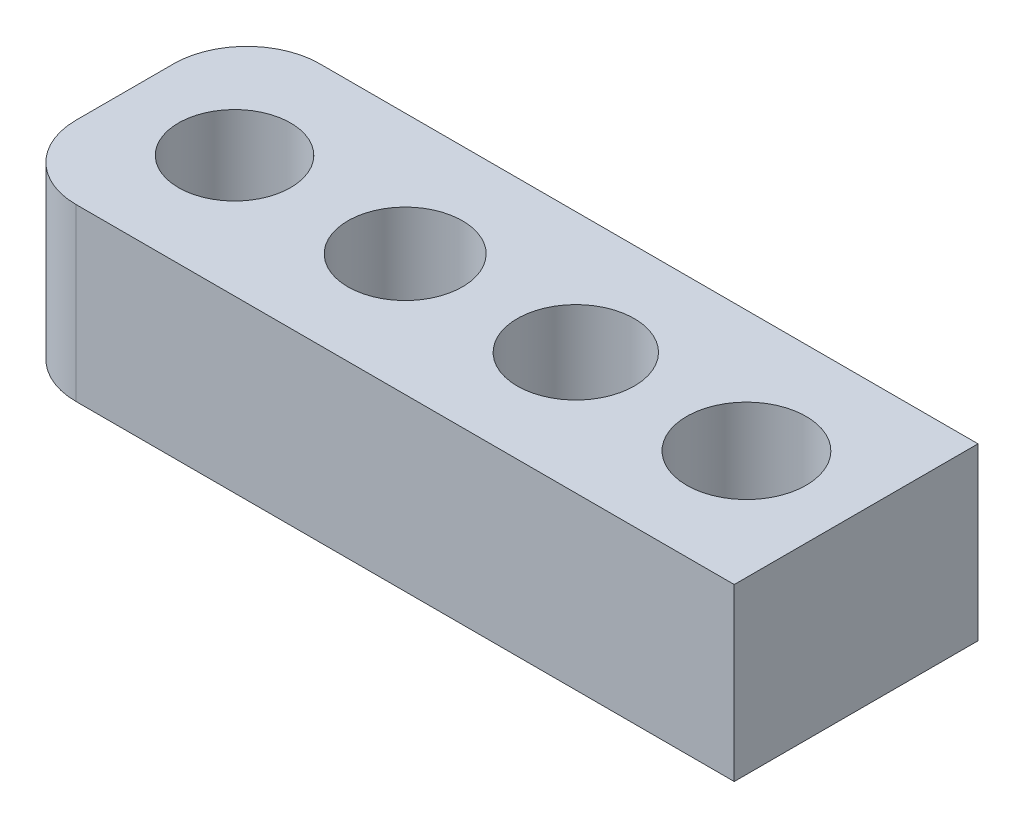
ISO-10303-21;
HEADER;
FILE_DESCRIPTION(('STEP AP214'),'2;1');
FILE_NAME('part.step','',(''),(''),'','','');
FILE_SCHEMA(('AUTOMOTIVE_DESIGN { 1 0 10303 214 1 1 1 1 }'));
ENDSEC;
DATA;
#1=APPLICATION_CONTEXT('core data for automotive mechanical design processes');
#2=APPLICATION_PROTOCOL_DEFINITION('international standard','automotive_design',2000,#1);
#3=PRODUCT_CONTEXT('',#1,'mechanical');
#4=PRODUCT('Part','Part','',(#3));
#5=PRODUCT_RELATED_PRODUCT_CATEGORY('part','',(#4));
#6=PRODUCT_DEFINITION_FORMATION('','',#4);
#7=PRODUCT_DEFINITION_CONTEXT('part definition',#1,'design');
#8=PRODUCT_DEFINITION('design','',#6,#7);
#9=PRODUCT_DEFINITION_SHAPE('','',#8);
#10=(LENGTH_UNIT() NAMED_UNIT(*) SI_UNIT(.MILLI.,.METRE.));
#11=(NAMED_UNIT(*) PLANE_ANGLE_UNIT() SI_UNIT($,.RADIAN.));
#12=(NAMED_UNIT(*) SI_UNIT($,.STERADIAN.) SOLID_ANGLE_UNIT());
#13=UNCERTAINTY_MEASURE_WITH_UNIT(LENGTH_MEASURE(1.E-05),#10,'distance_accuracy_value','');
#14=(GEOMETRIC_REPRESENTATION_CONTEXT(3) GLOBAL_UNCERTAINTY_ASSIGNED_CONTEXT((#13)) GLOBAL_UNIT_ASSIGNED_CONTEXT((#10,
#11,#12)) REPRESENTATION_CONTEXT('',''));
#15=CARTESIAN_POINT('',(0.,0.,0.));
#16=DIRECTION('',(0.,0.,1.));
#17=DIRECTION('',(1.,0.,0.));
#18=AXIS2_PLACEMENT_3D('',#15,#16,#17);
#19=CARTESIAN_POINT('',(0.,7.,0.));
#20=DIRECTION('',(0.,-1.,0.));
#21=DIRECTION('',(0.,0.,-1.));
#22=AXIS2_PLACEMENT_3D('',#19,#20,#21);
#23=PLANE('',#22);
#24=DIRECTION('',(0.,0.,1.));
#25=VECTOR('',#24,1.);
#26=CARTESIAN_POINT('',(0.,7.,0.));
#27=LINE('',#26,#25);
#28=CARTESIAN_POINT('',(0.,7.,-7.));
#29=VERTEX_POINT('',#28);
#30=CARTESIAN_POINT('',(0.,7.,-3.));
#31=VERTEX_POINT('',#30);
#32=EDGE_CURVE('E101',#29,#31,#27,.T.);
#33=ORIENTED_EDGE('',*,*,#32,.T.);
#34=CARTESIAN_POINT('',(3.,7.,-3.));
#35=DIRECTION('',(0.,-1.,0.));
#36=DIRECTION('',(0.,0.,-1.));
#37=AXIS2_PLACEMENT_3D('',#34,#35,#36);
#38=CIRCLE('',#37,3.);
#39=CARTESIAN_POINT('',(3.,7.,0.));
#40=VERTEX_POINT('',#39);
#41=EDGE_CURVE('E45',#31,#40,#38,.F.);
#42=ORIENTED_EDGE('',*,*,#41,.T.);
#43=DIRECTION('',(1.,0.,0.));
#44=VECTOR('',#43,1.);
#45=CARTESIAN_POINT('',(0.,7.,0.));
#46=LINE('',#45,#44);
#47=CARTESIAN_POINT('',(30.,7.,0.));
#48=VERTEX_POINT('',#47);
#49=EDGE_CURVE('E91',#40,#48,#46,.T.);
#50=ORIENTED_EDGE('',*,*,#49,.T.);
#51=DIRECTION('',(0.,0.,-1.));
#52=VECTOR('',#51,1.);
#53=CARTESIAN_POINT('',(30.,7.,0.));
#54=LINE('',#53,#52);
#55=CARTESIAN_POINT('',(30.,7.,-10.));
#56=VERTEX_POINT('',#55);
#57=EDGE_CURVE('E95',#48,#56,#54,.T.);
#58=ORIENTED_EDGE('',*,*,#57,.T.);
#59=DIRECTION('',(-1.,0.,0.));
#60=VECTOR('',#59,1.);
#61=CARTESIAN_POINT('',(0.,7.,-10.));
#62=LINE('',#61,#60);
#63=CARTESIAN_POINT('',(3.,7.,-10.));
#64=VERTEX_POINT('',#63);
#65=EDGE_CURVE('E115',#56,#64,#62,.T.);
#66=ORIENTED_EDGE('',*,*,#65,.T.);
#67=CARTESIAN_POINT('',(3.,7.,-7.));
#68=DIRECTION('',(0.,-1.,0.));
#69=DIRECTION('',(0.,0.,-1.));
#70=AXIS2_PLACEMENT_3D('',#67,#68,#69);
#71=CIRCLE('',#70,3.);
#72=EDGE_CURVE('E138',#64,#29,#71,.F.);
#73=ORIENTED_EDGE('',*,*,#72,.T.);
#74=EDGE_LOOP('',(#33,#42,#50,#58,#66,#73));
#75=FACE_BOUND('',#74,.T.);
#76=CARTESIAN_POINT('',(4.5,7.,-5.));
#77=DIRECTION('',(0.,1.,0.));
#78=DIRECTION('',(0.,0.,1.));
#79=AXIS2_PLACEMENT_3D('',#76,#77,#78);
#80=CIRCLE('',#79,2.3);
#81=CARTESIAN_POINT('',(4.5,7.,-2.7));
#82=VERTEX_POINT('',#81);
#83=EDGE_CURVE('E122',#82,#82,#80,.T.);
#84=ORIENTED_EDGE('',*,*,#83,.F.);
#85=EDGE_LOOP('',(#84));
#86=FACE_BOUND('',#85,.T.);
#87=CARTESIAN_POINT('',(11.5,7.,-5.));
#88=DIRECTION('',(0.,1.,0.));
#89=DIRECTION('',(0.,0.,1.));
#90=AXIS2_PLACEMENT_3D('',#87,#88,#89);
#91=CIRCLE('',#90,2.35);
#92=CARTESIAN_POINT('',(11.5,7.,-2.65));
#93=VERTEX_POINT('',#92);
#94=EDGE_CURVE('E201',#93,#93,#91,.T.);
#95=ORIENTED_EDGE('',*,*,#94,.F.);
#96=EDGE_LOOP('',(#95));
#97=FACE_BOUND('',#96,.T.);
#98=CARTESIAN_POINT('',(18.5,7.,-5.));
#99=DIRECTION('',(0.,1.,0.));
#100=DIRECTION('',(0.,0.,1.));
#101=AXIS2_PLACEMENT_3D('',#98,#99,#100);
#102=CIRCLE('',#101,2.4);
#103=CARTESIAN_POINT('',(18.5,7.,-2.6));
#104=VERTEX_POINT('',#103);
#105=EDGE_CURVE('E195',#104,#104,#102,.T.);
#106=ORIENTED_EDGE('',*,*,#105,.F.);
#107=EDGE_LOOP('',(#106));
#108=FACE_BOUND('',#107,.T.);
#109=CARTESIAN_POINT('',(25.5,7.,-5.));
#110=DIRECTION('',(0.,1.,0.));
#111=DIRECTION('',(0.,0.,1.));
#112=AXIS2_PLACEMENT_3D('',#109,#110,#111);
#113=CIRCLE('',#112,2.45);
#114=CARTESIAN_POINT('',(25.5,7.,-2.54999999999999));
#115=VERTEX_POINT('',#114);
#116=EDGE_CURVE('E186',#115,#115,#113,.T.);
#117=ORIENTED_EDGE('',*,*,#116,.F.);
#118=EDGE_LOOP('',(#117));
#119=FACE_BOUND('',#118,.T.);
#120=ADVANCED_FACE('F37',(#75,#86,#97,#108,#119),#23,.F.);
#121=CARTESIAN_POINT('',(0.,0.,0.));
#122=DIRECTION('',(0.,-1.,0.));
#123=DIRECTION('',(0.,0.,-1.));
#124=AXIS2_PLACEMENT_3D('',#121,#122,#123);
#125=PLANE('',#124);
#126=CARTESIAN_POINT('',(18.5,0.,-5.));
#127=DIRECTION('',(0.,1.,0.));
#128=DIRECTION('',(0.,0.,1.));
#129=AXIS2_PLACEMENT_3D('',#126,#127,#128);
#130=CIRCLE('',#129,2.4);
#131=CARTESIAN_POINT('',(18.5,0.,-2.6));
#132=VERTEX_POINT('',#131);
#133=EDGE_CURVE('E192',#132,#132,#130,.T.);
#134=ORIENTED_EDGE('',*,*,#133,.T.);
#135=EDGE_LOOP('',(#134));
#136=FACE_BOUND('',#135,.T.);
#137=CARTESIAN_POINT('',(4.5,0.,-5.));
#138=DIRECTION('',(0.,1.,0.));
#139=DIRECTION('',(0.,0.,1.));
#140=AXIS2_PLACEMENT_3D('',#137,#138,#139);
#141=CIRCLE('',#140,2.3);
#142=CARTESIAN_POINT('',(4.5,0.,-2.7));
#143=VERTEX_POINT('',#142);
#144=EDGE_CURVE('E204',#143,#143,#141,.T.);
#145=ORIENTED_EDGE('',*,*,#144,.T.);
#146=EDGE_LOOP('',(#145));
#147=FACE_BOUND('',#146,.T.);
#148=DIRECTION('',(1.,0.,0.));
#149=VECTOR('',#148,1.);
#150=CARTESIAN_POINT('',(0.,0.,0.));
#151=LINE('',#150,#149);
#152=CARTESIAN_POINT('',(3.,0.,0.));
#153=VERTEX_POINT('',#152);
#154=CARTESIAN_POINT('',(30.,0.,0.));
#155=VERTEX_POINT('',#154);
#156=EDGE_CURVE('E107',#153,#155,#151,.T.);
#157=ORIENTED_EDGE('',*,*,#156,.F.);
#158=CARTESIAN_POINT('',(3.,0.,-3.));
#159=DIRECTION('',(0.,-1.,0.));
#160=DIRECTION('',(0.,0.,-1.));
#161=AXIS2_PLACEMENT_3D('',#158,#159,#160);
#162=CIRCLE('',#161,3.);
#163=CARTESIAN_POINT('',(0.,0.,-3.));
#164=VERTEX_POINT('',#163);
#165=EDGE_CURVE('E132',#153,#164,#162,.T.);
#166=ORIENTED_EDGE('',*,*,#165,.T.);
#167=DIRECTION('',(0.,0.,1.));
#168=VECTOR('',#167,1.);
#169=CARTESIAN_POINT('',(0.,0.,0.));
#170=LINE('',#169,#168);
#171=CARTESIAN_POINT('',(0.,0.,-7.));
#172=VERTEX_POINT('',#171);
#173=EDGE_CURVE('E120',#172,#164,#170,.T.);
#174=ORIENTED_EDGE('',*,*,#173,.F.);
#175=CARTESIAN_POINT('',(3.,0.,-7.));
#176=DIRECTION('',(0.,-1.,0.));
#177=DIRECTION('',(0.,0.,-1.));
#178=AXIS2_PLACEMENT_3D('',#175,#176,#177);
#179=CIRCLE('',#178,3.);
#180=CARTESIAN_POINT('',(3.,0.,-10.));
#181=VERTEX_POINT('',#180);
#182=EDGE_CURVE('E130',#172,#181,#179,.T.);
#183=ORIENTED_EDGE('',*,*,#182,.T.);
#184=DIRECTION('',(-1.,0.,0.));
#185=VECTOR('',#184,1.);
#186=CARTESIAN_POINT('',(0.,0.,-10.));
#187=LINE('',#186,#185);
#188=CARTESIAN_POINT('',(30.,0.,-10.));
#189=VERTEX_POINT('',#188);
#190=EDGE_CURVE('E126',#189,#181,#187,.T.);
#191=ORIENTED_EDGE('',*,*,#190,.F.);
#192=DIRECTION('',(0.,0.,-1.));
#193=VECTOR('',#192,1.);
#194=CARTESIAN_POINT('',(30.,0.,0.));
#195=LINE('',#194,#193);
#196=EDGE_CURVE('E124',#155,#189,#195,.T.);
#197=ORIENTED_EDGE('',*,*,#196,.F.);
#198=EDGE_LOOP('',(#157,#166,#174,#183,#191,#197));
#199=FACE_BOUND('',#198,.T.);
#200=CARTESIAN_POINT('',(11.5,0.,-5.));
#201=DIRECTION('',(0.,1.,0.));
#202=DIRECTION('',(0.,0.,1.));
#203=AXIS2_PLACEMENT_3D('',#200,#201,#202);
#204=CIRCLE('',#203,2.35);
#205=CARTESIAN_POINT('',(11.5,0.,-2.65));
#206=VERTEX_POINT('',#205);
#207=EDGE_CURVE('E198',#206,#206,#204,.T.);
#208=ORIENTED_EDGE('',*,*,#207,.T.);
#209=EDGE_LOOP('',(#208));
#210=FACE_BOUND('',#209,.T.);
#211=CARTESIAN_POINT('',(25.5,0.,-5.));
#212=DIRECTION('',(0.,1.,0.));
#213=DIRECTION('',(0.,0.,1.));
#214=AXIS2_PLACEMENT_3D('',#211,#212,#213);
#215=CIRCLE('',#214,2.45);
#216=CARTESIAN_POINT('',(25.5,0.,-2.54999999999999));
#217=VERTEX_POINT('',#216);
#218=EDGE_CURVE('E189',#217,#217,#215,.T.);
#219=ORIENTED_EDGE('',*,*,#218,.T.);
#220=EDGE_LOOP('',(#219));
#221=FACE_BOUND('',#220,.T.);
#222=ADVANCED_FACE('F146',(#136,#147,#199,#210,#221),#125,.T.);
#223=CARTESIAN_POINT('',(0.,7.,0.));
#224=DIRECTION('',(1.,0.,0.));
#225=DIRECTION('',(0.,0.,-1.));
#226=AXIS2_PLACEMENT_3D('',#223,#224,#225);
#227=PLANE('',#226);
#228=ORIENTED_EDGE('',*,*,#173,.T.);
#229=DIRECTION('',(0.,-1.,0.));
#230=VECTOR('',#229,1.);
#231=CARTESIAN_POINT('',(0.,7.,-3.));
#232=LINE('',#231,#230);
#233=EDGE_CURVE('E58',#164,#31,#232,.F.);
#234=ORIENTED_EDGE('',*,*,#233,.T.);
#235=ORIENTED_EDGE('',*,*,#32,.F.);
#236=DIRECTION('',(0.,-1.,0.));
#237=VECTOR('',#236,1.);
#238=CARTESIAN_POINT('',(0.,7.,-7.));
#239=LINE('',#238,#237);
#240=EDGE_CURVE('E134',#29,#172,#239,.T.);
#241=ORIENTED_EDGE('',*,*,#240,.T.);
#242=EDGE_LOOP('',(#228,#234,#235,#241));
#243=FACE_BOUND('',#242,.T.);
#244=ADVANCED_FACE('F142',(#243),#227,.F.);
#245=CARTESIAN_POINT('',(0.,7.,0.));
#246=DIRECTION('',(0.,0.,-1.));
#247=DIRECTION('',(-1.,0.,0.));
#248=AXIS2_PLACEMENT_3D('',#245,#246,#247);
#249=PLANE('',#248);
#250=ORIENTED_EDGE('',*,*,#49,.F.);
#251=DIRECTION('',(0.,-1.,0.));
#252=VECTOR('',#251,1.);
#253=CARTESIAN_POINT('',(3.,7.,0.));
#254=LINE('',#253,#252);
#255=EDGE_CURVE('E110',#40,#153,#254,.T.);
#256=ORIENTED_EDGE('',*,*,#255,.T.);
#257=ORIENTED_EDGE('',*,*,#156,.T.);
#258=DIRECTION('',(0.,-1.,0.));
#259=VECTOR('',#258,1.);
#260=CARTESIAN_POINT('',(30.,7.,0.));
#261=LINE('',#260,#259);
#262=EDGE_CURVE('E104',#48,#155,#261,.T.);
#263=ORIENTED_EDGE('',*,*,#262,.F.);
#264=EDGE_LOOP('',(#250,#256,#257,#263));
#265=FACE_BOUND('',#264,.T.);
#266=ADVANCED_FACE('F105',(#265),#249,.F.);
#267=CARTESIAN_POINT('',(30.,7.,0.));
#268=DIRECTION('',(-1.,0.,0.));
#269=DIRECTION('',(0.,0.,1.));
#270=AXIS2_PLACEMENT_3D('',#267,#268,#269);
#271=PLANE('',#270);
#272=ORIENTED_EDGE('',*,*,#196,.T.);
#273=DIRECTION('',(0.,-1.,0.));
#274=VECTOR('',#273,1.);
#275=CARTESIAN_POINT('',(30.,7.,-10.));
#276=LINE('',#275,#274);
#277=EDGE_CURVE('E111',#56,#189,#276,.T.);
#278=ORIENTED_EDGE('',*,*,#277,.F.);
#279=ORIENTED_EDGE('',*,*,#57,.F.);
#280=ORIENTED_EDGE('',*,*,#262,.T.);
#281=EDGE_LOOP('',(#272,#278,#279,#280));
#282=FACE_BOUND('',#281,.T.);
#283=ADVANCED_FACE('F113',(#282),#271,.F.);
#284=CARTESIAN_POINT('',(0.,7.,-10.));
#285=DIRECTION('',(0.,0.,1.));
#286=DIRECTION('',(1.,0.,0.));
#287=AXIS2_PLACEMENT_3D('',#284,#285,#286);
#288=PLANE('',#287);
#289=ORIENTED_EDGE('',*,*,#190,.T.);
#290=DIRECTION('',(0.,-1.,0.));
#291=VECTOR('',#290,1.);
#292=CARTESIAN_POINT('',(3.,7.,-10.));
#293=LINE('',#292,#291);
#294=EDGE_CURVE('E11',#181,#64,#293,.F.);
#295=ORIENTED_EDGE('',*,*,#294,.T.);
#296=ORIENTED_EDGE('',*,*,#65,.F.);
#297=ORIENTED_EDGE('',*,*,#277,.T.);
#298=EDGE_LOOP('',(#289,#295,#296,#297));
#299=FACE_BOUND('',#298,.T.);
#300=ADVANCED_FACE('F148',(#299),#288,.F.);
#301=CARTESIAN_POINT('',(4.5,7.,-5.));
#302=DIRECTION('',(0.,-1.,0.));
#303=DIRECTION('',(0.,0.,-1.));
#304=AXIS2_PLACEMENT_3D('',#301,#302,#303);
#305=CYLINDRICAL_SURFACE('',#304,2.3);
#306=ORIENTED_EDGE('',*,*,#83,.T.);
#307=EDGE_LOOP('',(#306));
#308=FACE_BOUND('',#307,.T.);
#309=ORIENTED_EDGE('',*,*,#144,.F.);
#310=EDGE_LOOP('',(#309));
#311=FACE_BOUND('',#310,.T.);
#312=ADVANCED_FACE('F150',(#308,#311),#305,.F.);
#313=CARTESIAN_POINT('',(11.5,7.,-5.));
#314=DIRECTION('',(0.,-1.,0.));
#315=DIRECTION('',(0.,0.,-1.));
#316=AXIS2_PLACEMENT_3D('',#313,#314,#315);
#317=CYLINDRICAL_SURFACE('',#316,2.35);
#318=ORIENTED_EDGE('',*,*,#94,.T.);
#319=EDGE_LOOP('',(#318));
#320=FACE_BOUND('',#319,.T.);
#321=ORIENTED_EDGE('',*,*,#207,.F.);
#322=EDGE_LOOP('',(#321));
#323=FACE_BOUND('',#322,.T.);
#324=ADVANCED_FACE('F156',(#320,#323),#317,.F.);
#325=CARTESIAN_POINT('',(18.5,7.,-5.));
#326=DIRECTION('',(0.,-1.,0.));
#327=DIRECTION('',(0.,0.,-1.));
#328=AXIS2_PLACEMENT_3D('',#325,#326,#327);
#329=CYLINDRICAL_SURFACE('',#328,2.4);
#330=ORIENTED_EDGE('',*,*,#105,.T.);
#331=EDGE_LOOP('',(#330));
#332=FACE_BOUND('',#331,.T.);
#333=ORIENTED_EDGE('',*,*,#133,.F.);
#334=EDGE_LOOP('',(#333));
#335=FACE_BOUND('',#334,.T.);
#336=ADVANCED_FACE('F170',(#332,#335),#329,.F.);
#337=CARTESIAN_POINT('',(25.5,7.,-5.));
#338=DIRECTION('',(0.,-1.,0.));
#339=DIRECTION('',(0.,0.,-1.));
#340=AXIS2_PLACEMENT_3D('',#337,#338,#339);
#341=CYLINDRICAL_SURFACE('',#340,2.45);
#342=ORIENTED_EDGE('',*,*,#116,.T.);
#343=EDGE_LOOP('',(#342));
#344=FACE_BOUND('',#343,.T.);
#345=ORIENTED_EDGE('',*,*,#218,.F.);
#346=EDGE_LOOP('',(#345));
#347=FACE_BOUND('',#346,.T.);
#348=ADVANCED_FACE('F174',(#344,#347),#341,.F.);
#349=CARTESIAN_POINT('',(3.,7.,-3.));
#350=DIRECTION('',(0.,-1.,0.));
#351=DIRECTION('',(0.,0.,-1.));
#352=AXIS2_PLACEMENT_3D('',#349,#350,#351);
#353=CYLINDRICAL_SURFACE('',#352,3.);
#354=ORIENTED_EDGE('',*,*,#41,.F.);
#355=ORIENTED_EDGE('',*,*,#233,.F.);
#356=ORIENTED_EDGE('',*,*,#165,.F.);
#357=ORIENTED_EDGE('',*,*,#255,.F.);
#358=EDGE_LOOP('',(#354,#355,#356,#357));
#359=FACE_BOUND('',#358,.T.);
#360=ADVANCED_FACE('F177',(#359),#353,.T.);
#361=CARTESIAN_POINT('',(3.,7.,-7.));
#362=DIRECTION('',(0.,-1.,0.));
#363=DIRECTION('',(0.,0.,-1.));
#364=AXIS2_PLACEMENT_3D('',#361,#362,#363);
#365=CYLINDRICAL_SURFACE('',#364,3.);
#366=ORIENTED_EDGE('',*,*,#72,.F.);
#367=ORIENTED_EDGE('',*,*,#294,.F.);
#368=ORIENTED_EDGE('',*,*,#182,.F.);
#369=ORIENTED_EDGE('',*,*,#240,.F.);
#370=EDGE_LOOP('',(#366,#367,#368,#369));
#371=FACE_BOUND('',#370,.T.);
#372=ADVANCED_FACE('F39',(#371),#365,.T.);
#373=CLOSED_SHELL('',(#120,#222,#244,#266,#283,#300,#312,#324,#336,#348,#360,#372));
#374=MANIFOLD_SOLID_BREP('B2',#373);
#375=ADVANCED_BREP_SHAPE_REPRESENTATION('',(#18,#374),#14);
#376=SHAPE_DEFINITION_REPRESENTATION(#9,#375);
ENDSEC;
END-ISO-10303-21;
